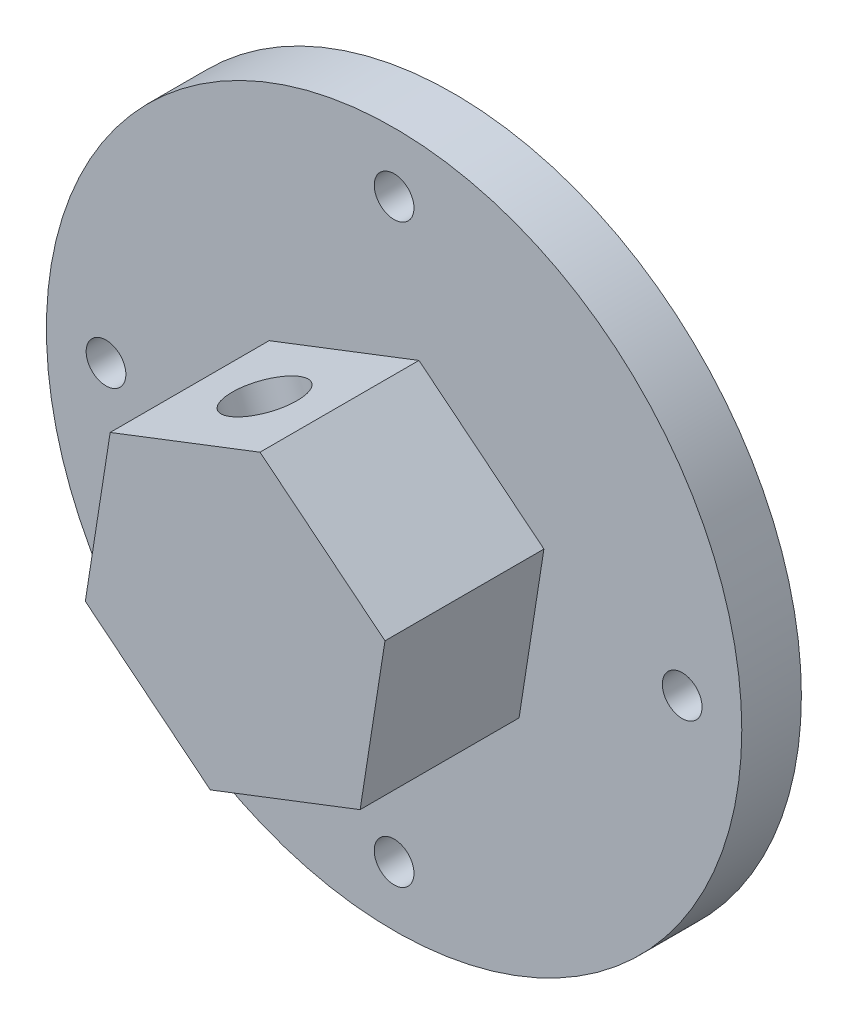
ISO-10303-21;
HEADER;
FILE_DESCRIPTION(('STEP AP214'),'2;1');
FILE_NAME('part.step','',(''),(''),'','','');
FILE_SCHEMA(('AUTOMOTIVE_DESIGN { 1 0 10303 214 1 1 1 1 }'));
ENDSEC;
DATA;
#1=APPLICATION_CONTEXT('core data for automotive mechanical design processes');
#2=APPLICATION_PROTOCOL_DEFINITION('international standard','automotive_design',2000,#1);
#3=PRODUCT_CONTEXT('',#1,'mechanical');
#4=PRODUCT('Part','Part','',(#3));
#5=PRODUCT_RELATED_PRODUCT_CATEGORY('part','',(#4));
#6=PRODUCT_DEFINITION_FORMATION('','',#4);
#7=PRODUCT_DEFINITION_CONTEXT('part definition',#1,'design');
#8=PRODUCT_DEFINITION('design','',#6,#7);
#9=PRODUCT_DEFINITION_SHAPE('','',#8);
#10=(LENGTH_UNIT() NAMED_UNIT(*) SI_UNIT(.MILLI.,.METRE.));
#11=(NAMED_UNIT(*) PLANE_ANGLE_UNIT() SI_UNIT($,.RADIAN.));
#12=(NAMED_UNIT(*) SI_UNIT($,.STERADIAN.) SOLID_ANGLE_UNIT());
#13=UNCERTAINTY_MEASURE_WITH_UNIT(LENGTH_MEASURE(1.E-05),#10,'distance_accuracy_value','');
#14=(GEOMETRIC_REPRESENTATION_CONTEXT(3) GLOBAL_UNCERTAINTY_ASSIGNED_CONTEXT((#13)) GLOBAL_UNIT_ASSIGNED_CONTEXT((#10,
#11,#12)) REPRESENTATION_CONTEXT('',''));
#15=CARTESIAN_POINT('',(0.,0.,0.));
#16=DIRECTION('',(0.,0.,1.));
#17=DIRECTION('',(1.,0.,0.));
#18=AXIS2_PLACEMENT_3D('',#15,#16,#17);
#19=CARTESIAN_POINT('',(0.,0.,3.));
#20=DIRECTION('',(0.,0.,1.));
#21=DIRECTION('',(1.,0.,0.));
#22=AXIS2_PLACEMENT_3D('',#19,#20,#21);
#23=PLANE('',#22);
#24=CARTESIAN_POINT('',(5.3829797365887E-13,-14.5,3.));
#25=DIRECTION('',(0.,0.,1.));
#26=DIRECTION('',(1.,0.,0.));
#27=AXIS2_PLACEMENT_3D('',#24,#25,#26);
#28=CIRCLE('',#27,1.);
#29=CARTESIAN_POINT('',(1.00000000000054,-14.5,3.));
#30=VERTEX_POINT('',#29);
#31=EDGE_CURVE('E145',#30,#30,#28,.T.);
#32=ORIENTED_EDGE('',*,*,#31,.F.);
#33=EDGE_LOOP('',(#32));
#34=FACE_BOUND('',#33,.T.);
#35=CARTESIAN_POINT('',(0.,14.5,3.));
#36=DIRECTION('',(0.,0.,1.));
#37=DIRECTION('',(1.,0.,0.));
#38=AXIS2_PLACEMENT_3D('',#35,#36,#37);
#39=CIRCLE('',#38,1.);
#40=CARTESIAN_POINT('',(1.,14.5,3.));
#41=VERTEX_POINT('',#40);
#42=EDGE_CURVE('E157',#41,#41,#39,.T.);
#43=ORIENTED_EDGE('',*,*,#42,.F.);
#44=EDGE_LOOP('',(#43));
#45=FACE_BOUND('',#44,.T.);
#46=CARTESIAN_POINT('',(0.,0.,3.));
#47=DIRECTION('',(0.,0.,1.));
#48=DIRECTION('',(1.,0.,0.));
#49=AXIS2_PLACEMENT_3D('',#46,#47,#48);
#50=CIRCLE('',#49,17.5);
#51=CARTESIAN_POINT('',(17.5,0.,3.));
#52=VERTEX_POINT('',#51);
#53=EDGE_CURVE('E11',#52,#52,#50,.T.);
#54=ORIENTED_EDGE('',*,*,#53,.T.);
#55=EDGE_LOOP('',(#54));
#56=FACE_BOUND('',#55,.T.);
#57=CARTESIAN_POINT('',(14.5000000000003,2.69148986829435E-13,3.));
#58=DIRECTION('',(0.,0.,1.));
#59=DIRECTION('',(1.,0.,0.));
#60=AXIS2_PLACEMENT_3D('',#57,#58,#59);
#61=CIRCLE('',#60,1.);
#62=CARTESIAN_POINT('',(15.5000000000003,2.69148986829435E-13,3.));
#63=VERTEX_POINT('',#62);
#64=EDGE_CURVE('E151',#63,#63,#61,.T.);
#65=ORIENTED_EDGE('',*,*,#64,.F.);
#66=EDGE_LOOP('',(#65));
#67=FACE_BOUND('',#66,.T.);
#68=CARTESIAN_POINT('',(-14.4999999999997,-2.70924724688199E-13,3.));
#69=DIRECTION('',(0.,0.,1.));
#70=DIRECTION('',(1.,0.,0.));
#71=AXIS2_PLACEMENT_3D('',#68,#69,#70);
#72=CIRCLE('',#71,1.);
#73=CARTESIAN_POINT('',(-13.4999999999997,-2.70924724688199E-13,3.));
#74=VERTEX_POINT('',#73);
#75=EDGE_CURVE('E139',#74,#74,#72,.T.);
#76=ORIENTED_EDGE('',*,*,#75,.F.);
#77=EDGE_LOOP('',(#76));
#78=FACE_BOUND('',#77,.T.);
#79=DIRECTION('',(-0.932966399794684,-0.359963465999185,0.));
#80=VECTOR('',#79,1.);
#81=CARTESIAN_POINT('',(1.25079455247007,7.98553982651421,3.));
#82=LINE('',#81,#80);
#83=CARTESIAN_POINT('',(1.25079455247007,7.98553982651421,3.));
#84=VERTEX_POINT('',#83);
#85=CARTESIAN_POINT('',(-6.29028307645865,5.07598977061137,3.));
#86=VERTEX_POINT('',#85);
#87=EDGE_CURVE('E120',#84,#86,#82,.T.);
#88=ORIENTED_EDGE('',*,*,#87,.F.);
#89=DIRECTION('',(-0.778220705886931,0.627990870099913,0.));
#90=VECTOR('',#89,1.);
#91=CARTESIAN_POINT('',(7.54107762892871,2.90955005590284,3.));
#92=LINE('',#91,#90);
#93=CARTESIAN_POINT('',(7.54107762892871,2.90955005590284,3.));
#94=VERTEX_POINT('',#93);
#95=EDGE_CURVE('E117',#94,#84,#92,.T.);
#96=ORIENTED_EDGE('',*,*,#95,.F.);
#97=DIRECTION('',(0.154745693907753,0.987954336099097,0.));
#98=VECTOR('',#97,1.);
#99=CARTESIAN_POINT('',(6.29028307645864,-5.07598977061136,3.));
#100=LINE('',#99,#98);
#101=CARTESIAN_POINT('',(6.29028307645864,-5.07598977061137,3.));
#102=VERTEX_POINT('',#101);
#103=EDGE_CURVE('E76',#102,#94,#100,.T.);
#104=ORIENTED_EDGE('',*,*,#103,.F.);
#105=DIRECTION('',(0.932966399794684,0.359963465999185,0.));
#106=VECTOR('',#105,1.);
#107=CARTESIAN_POINT('',(-1.25079455247007,-7.9855398265142,3.));
#108=LINE('',#107,#106);
#109=CARTESIAN_POINT('',(-1.25079455247007,-7.9855398265142,3.));
#110=VERTEX_POINT('',#109);
#111=EDGE_CURVE('E126',#110,#102,#108,.T.);
#112=ORIENTED_EDGE('',*,*,#111,.F.);
#113=DIRECTION('',(0.778220705886931,-0.627990870099913,0.));
#114=VECTOR('',#113,1.);
#115=CARTESIAN_POINT('',(-7.54107762892871,-2.90955005590284,3.));
#116=LINE('',#115,#114);
#117=CARTESIAN_POINT('',(-7.54107762892871,-2.90955005590284,3.));
#118=VERTEX_POINT('',#117);
#119=EDGE_CURVE('E106',#118,#110,#116,.T.);
#120=ORIENTED_EDGE('',*,*,#119,.F.);
#121=DIRECTION('',(-0.154745693907752,-0.987954336099097,0.));
#122=VECTOR('',#121,1.);
#123=CARTESIAN_POINT('',(-6.29028307645865,5.07598977061137,3.));
#124=LINE('',#123,#122);
#125=EDGE_CURVE('E123',#86,#118,#124,.T.);
#126=ORIENTED_EDGE('',*,*,#125,.F.);
#127=EDGE_LOOP('',(#88,#96,#104,#112,#120,#126));
#128=FACE_BOUND('',#127,.T.);
#129=ADVANCED_FACE('F33',(#34,#45,#56,#67,#78,#128),#23,.T.);
#130=CARTESIAN_POINT('',(0.,0.,0.));
#131=DIRECTION('',(0.,0.,1.));
#132=DIRECTION('',(1.,0.,0.));
#133=AXIS2_PLACEMENT_3D('',#130,#131,#132);
#134=PLANE('',#133);
#135=CARTESIAN_POINT('',(0.,0.,0.));
#136=DIRECTION('',(0.,0.,1.));
#137=DIRECTION('',(1.,0.,0.));
#138=AXIS2_PLACEMENT_3D('',#135,#136,#137);
#139=CIRCLE('',#138,17.5);
#140=CARTESIAN_POINT('',(17.5,0.,0.));
#141=VERTEX_POINT('',#140);
#142=EDGE_CURVE('E37',#141,#141,#139,.T.);
#143=ORIENTED_EDGE('',*,*,#142,.F.);
#144=EDGE_LOOP('',(#143));
#145=FACE_BOUND('',#144,.T.);
#146=CARTESIAN_POINT('',(0.,14.5,0.));
#147=DIRECTION('',(0.,0.,1.));
#148=DIRECTION('',(1.,0.,0.));
#149=AXIS2_PLACEMENT_3D('',#146,#147,#148);
#150=CIRCLE('',#149,1.);
#151=CARTESIAN_POINT('',(1.,14.5,0.));
#152=VERTEX_POINT('',#151);
#153=EDGE_CURVE('E154',#152,#152,#150,.T.);
#154=ORIENTED_EDGE('',*,*,#153,.T.);
#155=EDGE_LOOP('',(#154));
#156=FACE_BOUND('',#155,.T.);
#157=CARTESIAN_POINT('',(14.5000000000003,2.69148986829435E-13,0.));
#158=DIRECTION('',(0.,0.,1.));
#159=DIRECTION('',(1.,0.,0.));
#160=AXIS2_PLACEMENT_3D('',#157,#158,#159);
#161=CIRCLE('',#160,1.);
#162=CARTESIAN_POINT('',(15.5000000000003,2.69148986829435E-13,0.));
#163=VERTEX_POINT('',#162);
#164=EDGE_CURVE('E148',#163,#163,#161,.T.);
#165=ORIENTED_EDGE('',*,*,#164,.T.);
#166=EDGE_LOOP('',(#165));
#167=FACE_BOUND('',#166,.T.);
#168=CARTESIAN_POINT('',(5.3829797365887E-13,-14.5,0.));
#169=DIRECTION('',(0.,0.,1.));
#170=DIRECTION('',(1.,0.,0.));
#171=AXIS2_PLACEMENT_3D('',#168,#169,#170);
#172=CIRCLE('',#171,1.);
#173=CARTESIAN_POINT('',(1.00000000000054,-14.5,0.));
#174=VERTEX_POINT('',#173);
#175=EDGE_CURVE('E142',#174,#174,#172,.T.);
#176=ORIENTED_EDGE('',*,*,#175,.T.);
#177=EDGE_LOOP('',(#176));
#178=FACE_BOUND('',#177,.T.);
#179=CARTESIAN_POINT('',(-14.4999999999997,-2.70924724688199E-13,0.));
#180=DIRECTION('',(0.,0.,1.));
#181=DIRECTION('',(1.,0.,0.));
#182=AXIS2_PLACEMENT_3D('',#179,#180,#181);
#183=CIRCLE('',#182,1.);
#184=CARTESIAN_POINT('',(-13.4999999999997,-2.70924724688199E-13,0.));
#185=VERTEX_POINT('',#184);
#186=EDGE_CURVE('E138',#185,#185,#183,.T.);
#187=ORIENTED_EDGE('',*,*,#186,.T.);
#188=EDGE_LOOP('',(#187));
#189=FACE_BOUND('',#188,.T.);
#190=ADVANCED_FACE('F163',(#145,#156,#167,#178,#189),#134,.F.);
#191=CARTESIAN_POINT('',(0.,0.,3.));
#192=DIRECTION('',(0.,0.,-1.));
#193=DIRECTION('',(-1.,0.,0.));
#194=AXIS2_PLACEMENT_3D('',#191,#192,#193);
#195=CYLINDRICAL_SURFACE('',#194,17.5);
#196=ORIENTED_EDGE('',*,*,#53,.F.);
#197=EDGE_LOOP('',(#196));
#198=FACE_BOUND('',#197,.T.);
#199=ORIENTED_EDGE('',*,*,#142,.T.);
#200=EDGE_LOOP('',(#199));
#201=FACE_BOUND('',#200,.T.);
#202=ADVANCED_FACE('F35',(#198,#201),#195,.T.);
#203=CARTESIAN_POINT('',(0.,14.5,3.));
#204=DIRECTION('',(0.,0.,-1.));
#205=DIRECTION('',(-1.,0.,0.));
#206=AXIS2_PLACEMENT_3D('',#203,#204,#205);
#207=CYLINDRICAL_SURFACE('',#206,1.);
#208=ORIENTED_EDGE('',*,*,#42,.T.);
#209=EDGE_LOOP('',(#208));
#210=FACE_BOUND('',#209,.T.);
#211=ORIENTED_EDGE('',*,*,#153,.F.);
#212=EDGE_LOOP('',(#211));
#213=FACE_BOUND('',#212,.T.);
#214=ADVANCED_FACE('F166',(#210,#213),#207,.F.);
#215=CARTESIAN_POINT('',(14.5000000000003,2.69148986829435E-13,3.));
#216=DIRECTION('',(0.,0.,-1.));
#217=DIRECTION('',(-1.,0.,0.));
#218=AXIS2_PLACEMENT_3D('',#215,#216,#217);
#219=CYLINDRICAL_SURFACE('',#218,1.);
#220=ORIENTED_EDGE('',*,*,#64,.T.);
#221=EDGE_LOOP('',(#220));
#222=FACE_BOUND('',#221,.T.);
#223=ORIENTED_EDGE('',*,*,#164,.F.);
#224=EDGE_LOOP('',(#223));
#225=FACE_BOUND('',#224,.T.);
#226=ADVANCED_FACE('F168',(#222,#225),#219,.F.);
#227=CARTESIAN_POINT('',(5.3829797365887E-13,-14.5,3.));
#228=DIRECTION('',(0.,0.,-1.));
#229=DIRECTION('',(-1.,0.,0.));
#230=AXIS2_PLACEMENT_3D('',#227,#228,#229);
#231=CYLINDRICAL_SURFACE('',#230,1.);
#232=ORIENTED_EDGE('',*,*,#31,.T.);
#233=EDGE_LOOP('',(#232));
#234=FACE_BOUND('',#233,.T.);
#235=ORIENTED_EDGE('',*,*,#175,.F.);
#236=EDGE_LOOP('',(#235));
#237=FACE_BOUND('',#236,.T.);
#238=ADVANCED_FACE('F175',(#234,#237),#231,.F.);
#239=CARTESIAN_POINT('',(-14.4999999999997,-2.70924724688199E-13,3.));
#240=DIRECTION('',(0.,0.,-1.));
#241=DIRECTION('',(-1.,0.,0.));
#242=AXIS2_PLACEMENT_3D('',#239,#240,#241);
#243=CYLINDRICAL_SURFACE('',#242,1.);
#244=ORIENTED_EDGE('',*,*,#75,.T.);
#245=EDGE_LOOP('',(#244));
#246=FACE_BOUND('',#245,.T.);
#247=ORIENTED_EDGE('',*,*,#186,.F.);
#248=EDGE_LOOP('',(#247));
#249=FACE_BOUND('',#248,.T.);
#250=ADVANCED_FACE('F234',(#246,#249),#243,.F.);
#251=CARTESIAN_POINT('',(7.54107762892871,2.90955005590284,11.));
#252=DIRECTION('',(-0.627990870099913,-0.778220705886932,0.));
#253=DIRECTION('',(0.778220705886932,-0.627990870099913,0.));
#254=AXIS2_PLACEMENT_3D('',#251,#252,#253);
#255=PLANE('',#254);
#256=ORIENTED_EDGE('',*,*,#95,.T.);
#257=DIRECTION('',(0.,0.,-1.));
#258=VECTOR('',#257,1.);
#259=CARTESIAN_POINT('',(1.25079455247007,7.98553982651421,11.));
#260=LINE('',#259,#258);
#261=CARTESIAN_POINT('',(1.25079455247007,7.98553982651421,11.));
#262=VERTEX_POINT('',#261);
#263=EDGE_CURVE('E136',#262,#84,#260,.T.);
#264=ORIENTED_EDGE('',*,*,#263,.F.);
#265=DIRECTION('',(-0.778220705886931,0.627990870099913,0.));
#266=VECTOR('',#265,1.);
#267=CARTESIAN_POINT('',(7.54107762892871,2.90955005590284,11.));
#268=LINE('',#267,#266);
#269=CARTESIAN_POINT('',(7.54107762892871,2.90955005590284,11.));
#270=VERTEX_POINT('',#269);
#271=EDGE_CURVE('E129',#270,#262,#268,.T.);
#272=ORIENTED_EDGE('',*,*,#271,.F.);
#273=DIRECTION('',(0.,0.,-1.));
#274=VECTOR('',#273,1.);
#275=CARTESIAN_POINT('',(7.54107762892871,2.90955005590284,11.));
#276=LINE('',#275,#274);
#277=EDGE_CURVE('E113',#270,#94,#276,.T.);
#278=ORIENTED_EDGE('',*,*,#277,.T.);
#279=EDGE_LOOP('',(#256,#264,#272,#278));
#280=FACE_BOUND('',#279,.T.);
#281=ADVANCED_FACE('F230',(#280),#255,.F.);
#282=CARTESIAN_POINT('',(1.25079455247007,7.98553982651421,11.));
#283=DIRECTION('',(0.359963465999185,-0.932966399794684,0.));
#284=DIRECTION('',(0.932966399794684,0.359963465999185,0.));
#285=AXIS2_PLACEMENT_3D('',#282,#283,#284);
#286=PLANE('',#285);
#287=CARTESIAN_POINT('',(-2.51974426199429,6.53076479856279,7.));
#288=DIRECTION('',(0.359963465999185,-0.932966399794684,0.));
#289=DIRECTION('',(0.932966399794684,0.359963465999185,0.));
#290=AXIS2_PLACEMENT_3D('',#287,#288,#289);
#291=CIRCLE('',#290,1.75);
#292=CARTESIAN_POINT('',(-0.887053062353596,7.16070086406137,7.));
#293=VERTEX_POINT('',#292);
#294=EDGE_CURVE('E121',#293,#293,#291,.F.);
#295=ORIENTED_EDGE('',*,*,#294,.F.);
#296=EDGE_LOOP('',(#295));
#297=FACE_BOUND('',#296,.T.);
#298=ORIENTED_EDGE('',*,*,#87,.T.);
#299=DIRECTION('',(0.,0.,-1.));
#300=VECTOR('',#299,1.);
#301=CARTESIAN_POINT('',(-6.29028307645865,5.07598977061137,11.));
#302=LINE('',#301,#300);
#303=CARTESIAN_POINT('',(-6.29028307645865,5.07598977061137,11.));
#304=VERTEX_POINT('',#303);
#305=EDGE_CURVE('E133',#304,#86,#302,.T.);
#306=ORIENTED_EDGE('',*,*,#305,.F.);
#307=DIRECTION('',(-0.932966399794684,-0.359963465999185,0.));
#308=VECTOR('',#307,1.);
#309=CARTESIAN_POINT('',(1.25079455247007,7.98553982651421,11.));
#310=LINE('',#309,#308);
#311=EDGE_CURVE('E84',#262,#304,#310,.T.);
#312=ORIENTED_EDGE('',*,*,#311,.F.);
#313=ORIENTED_EDGE('',*,*,#263,.T.);
#314=EDGE_LOOP('',(#298,#306,#312,#313));
#315=FACE_BOUND('',#314,.T.);
#316=ADVANCED_FACE('F199',(#297,#315),#286,.F.);
#317=CARTESIAN_POINT('',(-6.29028307645865,5.07598977061137,11.));
#318=DIRECTION('',(0.987954336099097,-0.154745693907752,0.));
#319=DIRECTION('',(0.154745693907752,0.987954336099097,0.));
#320=AXIS2_PLACEMENT_3D('',#317,#318,#319);
#321=PLANE('',#320);
#322=ORIENTED_EDGE('',*,*,#125,.T.);
#323=DIRECTION('',(0.,0.,-1.));
#324=VECTOR('',#323,1.);
#325=CARTESIAN_POINT('',(-7.54107762892871,-2.90955005590284,11.));
#326=LINE('',#325,#324);
#327=CARTESIAN_POINT('',(-7.54107762892871,-2.90955005590284,11.));
#328=VERTEX_POINT('',#327);
#329=EDGE_CURVE('E109',#328,#118,#326,.T.);
#330=ORIENTED_EDGE('',*,*,#329,.F.);
#331=DIRECTION('',(-0.154745693907752,-0.987954336099097,0.));
#332=VECTOR('',#331,1.);
#333=CARTESIAN_POINT('',(-6.29028307645865,5.07598977061137,11.));
#334=LINE('',#333,#332);
#335=EDGE_CURVE('E97',#304,#328,#334,.T.);
#336=ORIENTED_EDGE('',*,*,#335,.F.);
#337=ORIENTED_EDGE('',*,*,#305,.T.);
#338=EDGE_LOOP('',(#322,#330,#336,#337));
#339=FACE_BOUND('',#338,.T.);
#340=ADVANCED_FACE('F202',(#339),#321,.F.);
#341=CARTESIAN_POINT('',(-7.54107762892871,-2.90955005590284,11.));
#342=DIRECTION('',(0.627990870099913,0.778220705886931,0.));
#343=DIRECTION('',(-0.778220705886931,0.627990870099913,0.));
#344=AXIS2_PLACEMENT_3D('',#341,#342,#343);
#345=PLANE('',#344);
#346=ORIENTED_EDGE('',*,*,#119,.T.);
#347=DIRECTION('',(0.,0.,-1.));
#348=VECTOR('',#347,1.);
#349=CARTESIAN_POINT('',(-1.25079455247007,-7.9855398265142,11.));
#350=LINE('',#349,#348);
#351=CARTESIAN_POINT('',(-1.25079455247007,-7.9855398265142,11.));
#352=VERTEX_POINT('',#351);
#353=EDGE_CURVE('E103',#352,#110,#350,.T.);
#354=ORIENTED_EDGE('',*,*,#353,.F.);
#355=DIRECTION('',(0.778220705886931,-0.627990870099913,0.));
#356=VECTOR('',#355,1.);
#357=CARTESIAN_POINT('',(-7.54107762892871,-2.90955005590284,11.));
#358=LINE('',#357,#356);
#359=EDGE_CURVE('E91',#328,#352,#358,.T.);
#360=ORIENTED_EDGE('',*,*,#359,.F.);
#361=ORIENTED_EDGE('',*,*,#329,.T.);
#362=EDGE_LOOP('',(#346,#354,#360,#361));
#363=FACE_BOUND('',#362,.T.);
#364=ADVANCED_FACE('F104',(#363),#345,.F.);
#365=CARTESIAN_POINT('',(-1.25079455247007,-7.9855398265142,11.));
#366=DIRECTION('',(-0.359963465999185,0.932966399794684,0.));
#367=DIRECTION('',(-0.932966399794684,-0.359963465999185,0.));
#368=AXIS2_PLACEMENT_3D('',#365,#366,#367);
#369=PLANE('',#368);
#370=CARTESIAN_POINT('',(2.51974426199429,-6.53076479856278,7.));
#371=DIRECTION('',(0.359963465999185,-0.932966399794684,0.));
#372=DIRECTION('',(0.932966399794684,0.359963465999185,0.));
#373=AXIS2_PLACEMENT_3D('',#370,#371,#372);
#374=CIRCLE('',#373,1.75);
#375=CARTESIAN_POINT('',(4.15243546163499,-5.90082873306421,7.));
#376=VERTEX_POINT('',#375);
#377=EDGE_CURVE('E208',#376,#376,#374,.T.);
#378=ORIENTED_EDGE('',*,*,#377,.F.);
#379=EDGE_LOOP('',(#378));
#380=FACE_BOUND('',#379,.T.);
#381=ORIENTED_EDGE('',*,*,#111,.T.);
#382=DIRECTION('',(0.,0.,-1.));
#383=VECTOR('',#382,1.);
#384=CARTESIAN_POINT('',(6.29028307645864,-5.07598977061136,11.));
#385=LINE('',#384,#383);
#386=CARTESIAN_POINT('',(6.29028307645864,-5.07598977061136,11.));
#387=VERTEX_POINT('',#386);
#388=EDGE_CURVE('E48',#387,#102,#385,.T.);
#389=ORIENTED_EDGE('',*,*,#388,.F.);
#390=DIRECTION('',(0.932966399794684,0.359963465999185,0.));
#391=VECTOR('',#390,1.);
#392=CARTESIAN_POINT('',(-1.25079455247007,-7.9855398265142,11.));
#393=LINE('',#392,#391);
#394=EDGE_CURVE('E95',#352,#387,#393,.T.);
#395=ORIENTED_EDGE('',*,*,#394,.F.);
#396=ORIENTED_EDGE('',*,*,#353,.T.);
#397=EDGE_LOOP('',(#381,#389,#395,#396));
#398=FACE_BOUND('',#397,.T.);
#399=ADVANCED_FACE('F111',(#380,#398),#369,.F.);
#400=CARTESIAN_POINT('',(6.29028307645864,-5.07598977061136,11.));
#401=DIRECTION('',(-0.987954336099097,0.154745693907753,0.));
#402=DIRECTION('',(-0.154745693907753,-0.987954336099097,0.));
#403=AXIS2_PLACEMENT_3D('',#400,#401,#402);
#404=PLANE('',#403);
#405=ORIENTED_EDGE('',*,*,#103,.T.);
#406=ORIENTED_EDGE('',*,*,#277,.F.);
#407=DIRECTION('',(0.154745693907753,0.987954336099097,0.));
#408=VECTOR('',#407,1.);
#409=CARTESIAN_POINT('',(6.29028307645864,-5.07598977061136,11.));
#410=LINE('',#409,#408);
#411=EDGE_CURVE('E56',#387,#270,#410,.T.);
#412=ORIENTED_EDGE('',*,*,#411,.F.);
#413=ORIENTED_EDGE('',*,*,#388,.T.);
#414=EDGE_LOOP('',(#405,#406,#412,#413));
#415=FACE_BOUND('',#414,.T.);
#416=ADVANCED_FACE('F216',(#415),#404,.F.);
#417=CARTESIAN_POINT('',(0.,0.,11.));
#418=DIRECTION('',(0.,0.,1.));
#419=DIRECTION('',(1.,0.,0.));
#420=AXIS2_PLACEMENT_3D('',#417,#418,#419);
#421=PLANE('',#420);
#422=ORIENTED_EDGE('',*,*,#271,.T.);
#423=ORIENTED_EDGE('',*,*,#311,.T.);
#424=ORIENTED_EDGE('',*,*,#335,.T.);
#425=ORIENTED_EDGE('',*,*,#359,.T.);
#426=ORIENTED_EDGE('',*,*,#394,.T.);
#427=ORIENTED_EDGE('',*,*,#411,.T.);
#428=EDGE_LOOP('',(#422,#423,#424,#425,#426,#427));
#429=FACE_BOUND('',#428,.T.);
#430=ADVANCED_FACE('F93',(#429),#421,.T.);
#431=CARTESIAN_POINT('',(-8.14509693375366,21.1107583964648,7.));
#432=DIRECTION('',(0.359963465999184,-0.932966399794684,0.));
#433=DIRECTION('',(0.932966399794684,0.359963465999185,0.));
#434=AXIS2_PLACEMENT_3D('',#431,#432,#433);
#435=CYLINDRICAL_SURFACE('',#434,1.75);
#436=CARTESIAN_POINT('',(4.15243546163499,-5.90082873306421,7.));
#437=CARTESIAN_POINT('',(4.09994078951011,-5.76477113309415,7.));
#438=CARTESIAN_POINT('',(4.04744611738523,-5.62871353312409,7.));
#439=CARTESIAN_POINT('',(3.94245677313546,-5.35659833318398,7.));
#440=CARTESIAN_POINT('',(3.88996210101058,-5.22054073321392,7.));
#441=CARTESIAN_POINT('',(3.78497275676082,-4.9484255332738,7.));
#442=CARTESIAN_POINT('',(3.73247808463594,-4.81236793330374,7.));
#443=CARTESIAN_POINT('',(3.62748874038618,-4.54025273336363,7.));
#444=CARTESIAN_POINT('',(3.5749940682613,-4.40419513339357,7.));
#445=CARTESIAN_POINT('',(3.47000472401153,-4.13207993345345,7.));
#446=CARTESIAN_POINT('',(3.41751005188665,-3.9960223334834,7.));
#447=CARTESIAN_POINT('',(3.31252070763689,-3.72390713354328,7.));
#448=CARTESIAN_POINT('',(3.26002603551201,-3.58784953357322,7.));
#449=CARTESIAN_POINT('',(3.15503669126225,-3.3157343336331,7.));
#450=CARTESIAN_POINT('',(3.10254201913737,-3.17967673366305,7.));
#451=CARTESIAN_POINT('',(2.9975526748876,-2.90756153372293,7.));
#452=CARTESIAN_POINT('',(2.94505800276272,-2.77150393375287,7.));
#453=CARTESIAN_POINT('',(2.84006865851296,-2.49938873381276,7.));
#454=CARTESIAN_POINT('',(2.78757398638808,-2.3633311338427,7.));
#455=CARTESIAN_POINT('',(2.68258464213832,-2.09121593390258,7.));
#456=CARTESIAN_POINT('',(2.63008997001344,-1.95515833393253,7.));
#457=CARTESIAN_POINT('',(2.52510062576368,-1.68304313399241,7.));
#458=CARTESIAN_POINT('',(2.47260595363879,-1.54698553402235,7.));
#459=CARTESIAN_POINT('',(2.36761660938903,-1.27487033408224,7.));
#460=CARTESIAN_POINT('',(2.31512193726415,-1.13881273411218,7.));
#461=CARTESIAN_POINT('',(2.21013259301439,-0.866697534172064,7.));
#462=CARTESIAN_POINT('',(2.15763792088951,-0.730639934202006,7.));
#463=CARTESIAN_POINT('',(2.05264857663975,-0.458524734261889,7.));
#464=CARTESIAN_POINT('',(2.00015390451486,-0.322467134291831,7.));
#465=CARTESIAN_POINT('',(1.8951645602651,-0.0503519343517147,7.));
#466=CARTESIAN_POINT('',(1.84266988814022,0.0857056656183434,7.));
#467=CARTESIAN_POINT('',(1.73768054389046,0.35782086555846,7.));
#468=CARTESIAN_POINT('',(1.68518587176558,0.493878465528518,7.));
#469=CARTESIAN_POINT('',(1.58019652751582,0.765993665468635,7.));
#470=CARTESIAN_POINT('',(1.52770185539093,0.902051265438693,7.));
#471=CARTESIAN_POINT('',(1.42271251114117,1.17416646537881,7.));
#472=CARTESIAN_POINT('',(1.37021783901629,1.31022406534887,7.));
#473=CARTESIAN_POINT('',(1.26522849476653,1.58233926528898,7.));
#474=CARTESIAN_POINT('',(1.21273382264165,1.71839686525904,7.));
#475=CARTESIAN_POINT('',(1.10774447839188,1.99051206519916,7.));
#476=CARTESIAN_POINT('',(1.055249806267,2.12656966516922,7.));
#477=CARTESIAN_POINT('',(0.950260462017242,2.39868486510933,7.));
#478=CARTESIAN_POINT('',(0.897765789892361,2.53474246507939,7.));
#479=CARTESIAN_POINT('',(0.792776445642599,2.8068576650195,7.));
#480=CARTESIAN_POINT('',(0.740281773517718,2.94291526498956,7.));
#481=CARTESIAN_POINT('',(0.635292429267956,3.21503046492968,7.));
#482=CARTESIAN_POINT('',(0.582797757143075,3.35108806489974,7.));
#483=CARTESIAN_POINT('',(0.477808412893313,3.62320326483985,7.));
#484=CARTESIAN_POINT('',(0.425313740768432,3.75926086480991,7.));
#485=CARTESIAN_POINT('',(0.32032439651867,4.03137606475003,7.));
#486=CARTESIAN_POINT('',(0.267829724393789,4.16743366472009,7.));
#487=CARTESIAN_POINT('',(0.162840380144027,4.4395488646602,7.));
#488=CARTESIAN_POINT('',(0.110345708019146,4.57560646463026,7.));
#489=CARTESIAN_POINT('',(0.00535636376938311,4.84772166457038,7.));
#490=CARTESIAN_POINT('',(-0.0471383083554984,4.98377926454044,7.));
#491=CARTESIAN_POINT('',(-0.152127652605261,5.25589446448055,7.));
#492=CARTESIAN_POINT('',(-0.204622324730142,5.39195206445061,7.));
#493=CARTESIAN_POINT('',(-0.309611668979904,5.66406726439073,7.));
#494=CARTESIAN_POINT('',(-0.362106341104785,5.80012486436079,7.));
#495=CARTESIAN_POINT('',(-0.467095685354547,6.0722400643009,7.));
#496=CARTESIAN_POINT('',(-0.519590357479428,6.20829766427096,7.));
#497=CARTESIAN_POINT('',(-0.624579701729191,6.48041286421108,7.));
#498=CARTESIAN_POINT('',(-0.677074373854072,6.61647046418113,7.));
#499=CARTESIAN_POINT('',(-0.782063718103834,6.88858566412125,7.));
#500=CARTESIAN_POINT('',(-0.834558390228715,7.02464326409131,7.));
#501=CARTESIAN_POINT('',(-0.887053062353596,7.16070086406137,7.));
#502=B_SPLINE_CURVE_WITH_KNOTS('',3,(#436,#437,#438,#439,#440,#441,#442,#443,#444,#445,#446,
#447,#448,#449,#450,#451,#452,#453,#454,#455,#456,#457,#458,#459,#460,#461,#462,#463,#464,#465,
#466,#467,#468,#469,#470,#471,#472,#473,#474,#475,#476,#477,#478,#479,#480,#481,#482,#483,#484,
#485,#486,#487,#488,#489,#490,#491,#492,#493,#494,#495,#496,#497,#498,#499,#500,#501),
.UNSPECIFIED.,.F.,.F.,(4,2,2,2,2,2,2,2,2,2,2,2,2,2,2,2,2,2,2,2,2,2,2,2,2,2,2,2,2,2,2,2,4),(0.,
0.4375,0.875000000000001,1.3125,1.75,2.1875,2.625,3.0625,3.5,3.9375,4.375,4.8125,5.25,5.6875,
6.125,6.5625,7.,7.4375,7.875,8.3125,8.75,9.1875,9.625,10.0625,10.5,10.9375,11.375,11.8125,12.25,
12.6875,13.125,13.5625,14.),.UNSPECIFIED.);
#503=EDGE_CURVE('BSEAM212',#376,#293,#502,.T.);
#504=ORIENTED_EDGE('',*,*,#377,.T.);
#505=ORIENTED_EDGE('',*,*,#294,.T.);
#506=ORIENTED_EDGE('',*,*,#503,.T.);
#507=ORIENTED_EDGE('',*,*,#503,.F.);
#508=EDGE_LOOP('',(#504,#506,#505,#507));
#509=FACE_BOUND('',#508,.T.);
#510=ADVANCED_FACE('F212',(#509),#435,.F.);
#511=CLOSED_SHELL('',(#129,#190,#202,#214,#226,#238,#250,#281,#316,#340,#364,#399,#416,#430,#510));
#512=MANIFOLD_SOLID_BREP('B2',#511);
#513=ADVANCED_BREP_SHAPE_REPRESENTATION('',(#18,#512),#14);
#514=SHAPE_DEFINITION_REPRESENTATION(#9,#513);
ENDSEC;
END-ISO-10303-21;
